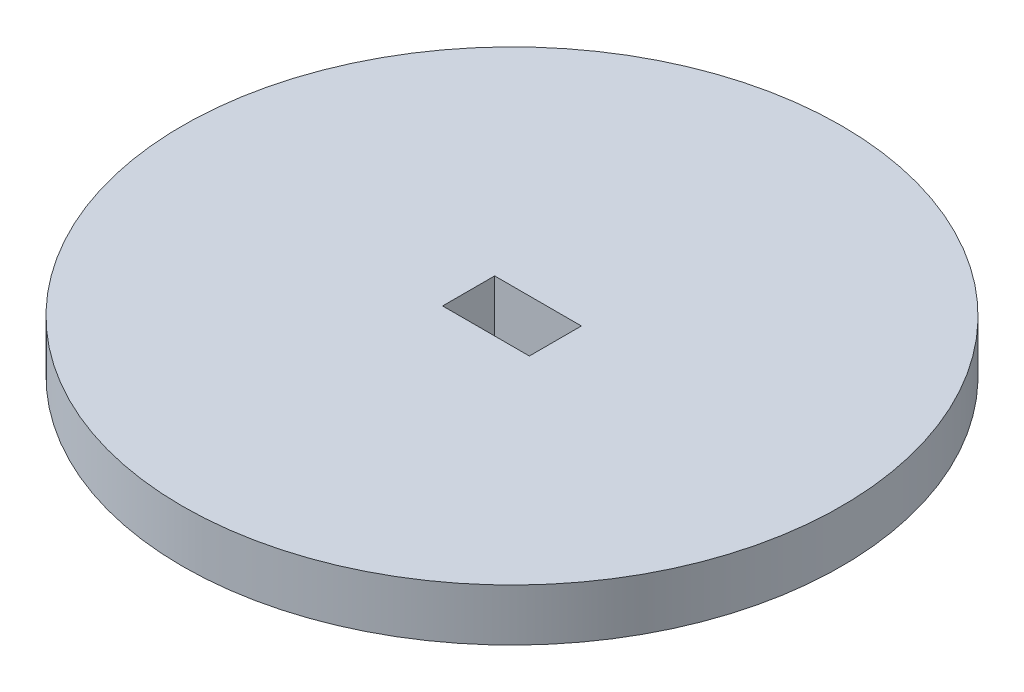
ISO-10303-21;
HEADER;
FILE_DESCRIPTION(('STEP AP214'),'2;1');
FILE_NAME('part.step','',(''),(''),'','','');
FILE_SCHEMA(('AUTOMOTIVE_DESIGN { 1 0 10303 214 1 1 1 1 }'));
ENDSEC;
DATA;
#1=APPLICATION_CONTEXT('core data for automotive mechanical design processes');
#2=APPLICATION_PROTOCOL_DEFINITION('international standard','automotive_design',2000,#1);
#3=PRODUCT_CONTEXT('',#1,'mechanical');
#4=PRODUCT('Part','Part','',(#3));
#5=PRODUCT_RELATED_PRODUCT_CATEGORY('part','',(#4));
#6=PRODUCT_DEFINITION_FORMATION('','',#4);
#7=PRODUCT_DEFINITION_CONTEXT('part definition',#1,'design');
#8=PRODUCT_DEFINITION('design','',#6,#7);
#9=PRODUCT_DEFINITION_SHAPE('','',#8);
#10=(LENGTH_UNIT() NAMED_UNIT(*) SI_UNIT(.MILLI.,.METRE.));
#11=(NAMED_UNIT(*) PLANE_ANGLE_UNIT() SI_UNIT($,.RADIAN.));
#12=(NAMED_UNIT(*) SI_UNIT($,.STERADIAN.) SOLID_ANGLE_UNIT());
#13=UNCERTAINTY_MEASURE_WITH_UNIT(LENGTH_MEASURE(1.E-05),#10,'distance_accuracy_value','');
#14=(GEOMETRIC_REPRESENTATION_CONTEXT(3) GLOBAL_UNCERTAINTY_ASSIGNED_CONTEXT((#13)) GLOBAL_UNIT_ASSIGNED_CONTEXT((#10,
#11,#12)) REPRESENTATION_CONTEXT('',''));
#15=CARTESIAN_POINT('',(0.,0.,0.));
#16=DIRECTION('',(0.,0.,1.));
#17=DIRECTION('',(1.,0.,0.));
#18=AXIS2_PLACEMENT_3D('',#15,#16,#17);
#19=CARTESIAN_POINT('',(0.,6.,0.));
#20=DIRECTION('',(0.,-1.,0.));
#21=DIRECTION('',(0.,0.,-1.));
#22=AXIS2_PLACEMENT_3D('',#19,#20,#21);
#23=CYLINDRICAL_SURFACE('',#22,38.);
#24=CARTESIAN_POINT('',(0.,6.,0.));
#25=DIRECTION('',(0.,1.,0.));
#26=DIRECTION('',(0.,0.,1.));
#27=AXIS2_PLACEMENT_3D('',#24,#25,#26);
#28=CIRCLE('',#27,38.);
#29=CARTESIAN_POINT('',(0.,6.,38.));
#30=VERTEX_POINT('',#29);
#31=EDGE_CURVE('E11',#30,#30,#28,.T.);
#32=ORIENTED_EDGE('',*,*,#31,.F.);
#33=EDGE_LOOP('',(#32));
#34=FACE_BOUND('',#33,.T.);
#35=CARTESIAN_POINT('',(0.,0.,0.));
#36=DIRECTION('',(0.,1.,0.));
#37=DIRECTION('',(0.,0.,1.));
#38=AXIS2_PLACEMENT_3D('',#35,#36,#37);
#39=CIRCLE('',#38,38.);
#40=CARTESIAN_POINT('',(0.,0.,38.));
#41=VERTEX_POINT('',#40);
#42=EDGE_CURVE('E43',#41,#41,#39,.T.);
#43=ORIENTED_EDGE('',*,*,#42,.T.);
#44=EDGE_LOOP('',(#43));
#45=FACE_BOUND('',#44,.T.);
#46=ADVANCED_FACE('F40',(#34,#45),#23,.T.);
#47=CARTESIAN_POINT('',(0.,6.,0.));
#48=DIRECTION('',(0.,1.,0.));
#49=DIRECTION('',(0.,0.,1.));
#50=AXIS2_PLACEMENT_3D('',#47,#48,#49);
#51=PLANE('',#50);
#52=DIRECTION('',(0.,0.,1.));
#53=VECTOR('',#52,1.);
#54=CARTESIAN_POINT('',(-5.,6.,3.));
#55=LINE('',#54,#53);
#56=CARTESIAN_POINT('',(-5.,6.,-3.));
#57=VERTEX_POINT('',#56);
#58=CARTESIAN_POINT('',(-5.,6.,3.));
#59=VERTEX_POINT('',#58);
#60=EDGE_CURVE('E55',#57,#59,#55,.T.);
#61=ORIENTED_EDGE('',*,*,#60,.F.);
#62=DIRECTION('',(-1.,0.,0.));
#63=VECTOR('',#62,1.);
#64=CARTESIAN_POINT('',(5.,6.,-3.));
#65=LINE('',#64,#63);
#66=CARTESIAN_POINT('',(5.,6.,-3.));
#67=VERTEX_POINT('',#66);
#68=EDGE_CURVE('E102',#67,#57,#65,.T.);
#69=ORIENTED_EDGE('',*,*,#68,.F.);
#70=DIRECTION('',(0.,0.,-1.));
#71=VECTOR('',#70,1.);
#72=CARTESIAN_POINT('',(5.,6.,3.));
#73=LINE('',#72,#71);
#74=CARTESIAN_POINT('',(5.,6.,3.));
#75=VERTEX_POINT('',#74);
#76=EDGE_CURVE('E107',#75,#67,#73,.T.);
#77=ORIENTED_EDGE('',*,*,#76,.F.);
#78=DIRECTION('',(1.,0.,0.));
#79=VECTOR('',#78,1.);
#80=CARTESIAN_POINT('',(5.,6.,3.));
#81=LINE('',#80,#79);
#82=EDGE_CURVE('E116',#59,#75,#81,.T.);
#83=ORIENTED_EDGE('',*,*,#82,.F.);
#84=EDGE_LOOP('',(#61,#69,#77,#83));
#85=FACE_BOUND('',#84,.T.);
#86=ORIENTED_EDGE('',*,*,#31,.T.);
#87=EDGE_LOOP('',(#86));
#88=FACE_BOUND('',#87,.T.);
#89=ADVANCED_FACE('F134',(#85,#88),#51,.T.);
#90=CARTESIAN_POINT('',(0.,0.,0.));
#91=DIRECTION('',(0.,1.,0.));
#92=DIRECTION('',(0.,0.,1.));
#93=AXIS2_PLACEMENT_3D('',#90,#91,#92);
#94=PLANE('',#93);
#95=DIRECTION('',(-1.,0.,0.));
#96=VECTOR('',#95,1.);
#97=CARTESIAN_POINT('',(5.,0.,-3.));
#98=LINE('',#97,#96);
#99=CARTESIAN_POINT('',(5.,0.,-3.));
#100=VERTEX_POINT('',#99);
#101=CARTESIAN_POINT('',(-5.,0.,-3.));
#102=VERTEX_POINT('',#101);
#103=EDGE_CURVE('E90',#100,#102,#98,.T.);
#104=ORIENTED_EDGE('',*,*,#103,.T.);
#105=DIRECTION('',(0.,0.,1.));
#106=VECTOR('',#105,1.);
#107=CARTESIAN_POINT('',(-5.,0.,3.));
#108=LINE('',#107,#106);
#109=CARTESIAN_POINT('',(-5.,0.,3.));
#110=VERTEX_POINT('',#109);
#111=EDGE_CURVE('E83',#102,#110,#108,.T.);
#112=ORIENTED_EDGE('',*,*,#111,.T.);
#113=DIRECTION('',(1.,0.,0.));
#114=VECTOR('',#113,1.);
#115=CARTESIAN_POINT('',(5.,0.,3.));
#116=LINE('',#115,#114);
#117=CARTESIAN_POINT('',(5.,0.,3.));
#118=VERTEX_POINT('',#117);
#119=EDGE_CURVE('E93',#110,#118,#116,.T.);
#120=ORIENTED_EDGE('',*,*,#119,.T.);
#121=DIRECTION('',(0.,0.,-1.));
#122=VECTOR('',#121,1.);
#123=CARTESIAN_POINT('',(5.,0.,3.));
#124=LINE('',#123,#122);
#125=EDGE_CURVE('E63',#118,#100,#124,.T.);
#126=ORIENTED_EDGE('',*,*,#125,.T.);
#127=EDGE_LOOP('',(#104,#112,#120,#126));
#128=FACE_BOUND('',#127,.T.);
#129=ORIENTED_EDGE('',*,*,#42,.F.);
#130=EDGE_LOOP('',(#129));
#131=FACE_BOUND('',#130,.T.);
#132=ADVANCED_FACE('F98',(#128,#131),#94,.F.);
#133=CARTESIAN_POINT('',(-5.,0.,3.));
#134=DIRECTION('',(-1.,0.,0.));
#135=DIRECTION('',(0.,0.,1.));
#136=AXIS2_PLACEMENT_3D('',#133,#134,#135);
#137=PLANE('',#136);
#138=ORIENTED_EDGE('',*,*,#60,.T.);
#139=DIRECTION('',(0.,1.,0.));
#140=VECTOR('',#139,1.);
#141=CARTESIAN_POINT('',(-5.,0.,3.));
#142=LINE('',#141,#140);
#143=EDGE_CURVE('E79',#110,#59,#142,.T.);
#144=ORIENTED_EDGE('',*,*,#143,.F.);
#145=ORIENTED_EDGE('',*,*,#111,.F.);
#146=DIRECTION('',(0.,1.,0.));
#147=VECTOR('',#146,1.);
#148=CARTESIAN_POINT('',(-5.,0.,-3.));
#149=LINE('',#148,#147);
#150=EDGE_CURVE('E122',#102,#57,#149,.T.);
#151=ORIENTED_EDGE('',*,*,#150,.T.);
#152=EDGE_LOOP('',(#138,#144,#145,#151));
#153=FACE_BOUND('',#152,.T.);
#154=ADVANCED_FACE('F81',(#153),#137,.F.);
#155=CARTESIAN_POINT('',(5.,0.,-3.));
#156=DIRECTION('',(0.,0.,-1.));
#157=DIRECTION('',(-1.,0.,0.));
#158=AXIS2_PLACEMENT_3D('',#155,#156,#157);
#159=PLANE('',#158);
#160=ORIENTED_EDGE('',*,*,#68,.T.);
#161=ORIENTED_EDGE('',*,*,#150,.F.);
#162=ORIENTED_EDGE('',*,*,#103,.F.);
#163=DIRECTION('',(0.,1.,0.));
#164=VECTOR('',#163,1.);
#165=CARTESIAN_POINT('',(5.,0.,-3.));
#166=LINE('',#165,#164);
#167=EDGE_CURVE('E125',#100,#67,#166,.T.);
#168=ORIENTED_EDGE('',*,*,#167,.T.);
#169=EDGE_LOOP('',(#160,#161,#162,#168));
#170=FACE_BOUND('',#169,.T.);
#171=ADVANCED_FACE('F137',(#170),#159,.F.);
#172=CARTESIAN_POINT('',(5.,0.,3.));
#173=DIRECTION('',(1.,0.,0.));
#174=DIRECTION('',(0.,0.,-1.));
#175=AXIS2_PLACEMENT_3D('',#172,#173,#174);
#176=PLANE('',#175);
#177=ORIENTED_EDGE('',*,*,#76,.T.);
#178=ORIENTED_EDGE('',*,*,#167,.F.);
#179=ORIENTED_EDGE('',*,*,#125,.F.);
#180=DIRECTION('',(0.,1.,0.));
#181=VECTOR('',#180,1.);
#182=CARTESIAN_POINT('',(5.,0.,3.));
#183=LINE('',#182,#181);
#184=EDGE_CURVE('E89',#118,#75,#183,.T.);
#185=ORIENTED_EDGE('',*,*,#184,.T.);
#186=EDGE_LOOP('',(#177,#178,#179,#185));
#187=FACE_BOUND('',#186,.T.);
#188=ADVANCED_FACE('F130',(#187),#176,.F.);
#189=CARTESIAN_POINT('',(5.,0.,3.));
#190=DIRECTION('',(0.,0.,1.));
#191=DIRECTION('',(1.,0.,0.));
#192=AXIS2_PLACEMENT_3D('',#189,#190,#191);
#193=PLANE('',#192);
#194=ORIENTED_EDGE('',*,*,#82,.T.);
#195=ORIENTED_EDGE('',*,*,#184,.F.);
#196=ORIENTED_EDGE('',*,*,#119,.F.);
#197=ORIENTED_EDGE('',*,*,#143,.T.);
#198=EDGE_LOOP('',(#194,#195,#196,#197));
#199=FACE_BOUND('',#198,.T.);
#200=ADVANCED_FACE('F94',(#199),#193,.F.);
#201=CLOSED_SHELL('',(#46,#89,#132,#154,#171,#188,#200));
#202=MANIFOLD_SOLID_BREP('B2',#201);
#203=ADVANCED_BREP_SHAPE_REPRESENTATION('',(#18,#202),#14);
#204=SHAPE_DEFINITION_REPRESENTATION(#9,#203);
ENDSEC;
END-ISO-10303-21;
